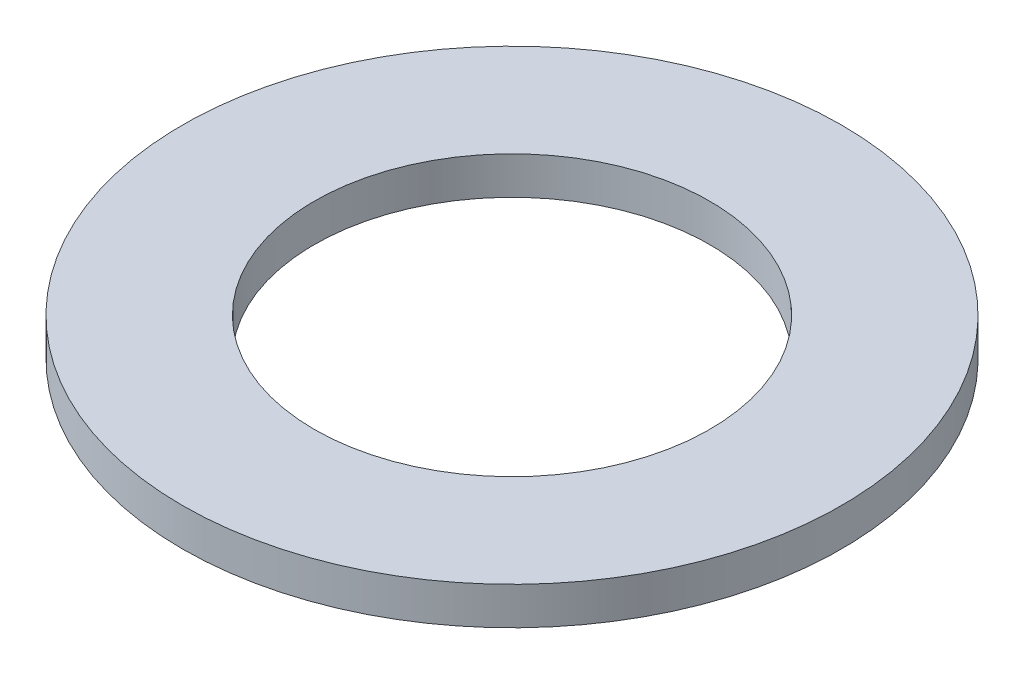
ISO-10303-21;
HEADER;
FILE_DESCRIPTION(('STEP AP214'),'2;1');
FILE_NAME('part.step','',(''),(''),'','','');
FILE_SCHEMA(('AUTOMOTIVE_DESIGN { 1 0 10303 214 1 1 1 1 }'));
ENDSEC;
DATA;
#1=APPLICATION_CONTEXT('core data for automotive mechanical design processes');
#2=APPLICATION_PROTOCOL_DEFINITION('international standard','automotive_design',2000,#1);
#3=PRODUCT_CONTEXT('',#1,'mechanical');
#4=PRODUCT('Part','Part','',(#3));
#5=PRODUCT_RELATED_PRODUCT_CATEGORY('part','',(#4));
#6=PRODUCT_DEFINITION_FORMATION('','',#4);
#7=PRODUCT_DEFINITION_CONTEXT('part definition',#1,'design');
#8=PRODUCT_DEFINITION('design','',#6,#7);
#9=PRODUCT_DEFINITION_SHAPE('','',#8);
#10=(LENGTH_UNIT() NAMED_UNIT(*) SI_UNIT(.MILLI.,.METRE.));
#11=(NAMED_UNIT(*) PLANE_ANGLE_UNIT() SI_UNIT($,.RADIAN.));
#12=(NAMED_UNIT(*) SI_UNIT($,.STERADIAN.) SOLID_ANGLE_UNIT());
#13=UNCERTAINTY_MEASURE_WITH_UNIT(LENGTH_MEASURE(1.E-05),#10,'distance_accuracy_value','');
#14=(GEOMETRIC_REPRESENTATION_CONTEXT(3) GLOBAL_UNCERTAINTY_ASSIGNED_CONTEXT((#13)) GLOBAL_UNIT_ASSIGNED_CONTEXT((#10,
#11,#12)) REPRESENTATION_CONTEXT('',''));
#15=CARTESIAN_POINT('',(0.,0.,0.));
#16=DIRECTION('',(0.,0.,1.));
#17=DIRECTION('',(1.,0.,0.));
#18=AXIS2_PLACEMENT_3D('',#15,#16,#17);
#19=CARTESIAN_POINT('',(0.,2.,0.));
#20=DIRECTION('',(0.,1.,0.));
#21=DIRECTION('',(0.,0.,1.));
#22=AXIS2_PLACEMENT_3D('',#19,#20,#21);
#23=PLANE('',#22);
#24=CARTESIAN_POINT('',(0.,2.,0.));
#25=DIRECTION('',(0.,1.,0.));
#26=DIRECTION('',(0.,0.,1.));
#27=AXIS2_PLACEMENT_3D('',#24,#25,#26);
#28=CIRCLE('',#27,17.5);
#29=CARTESIAN_POINT('',(0.,2.,17.5));
#30=VERTEX_POINT('',#29);
#31=EDGE_CURVE('E10',#30,#30,#28,.T.);
#32=ORIENTED_EDGE('',*,*,#31,.T.);
#33=EDGE_LOOP('',(#32));
#34=FACE_BOUND('',#33,.T.);
#35=CARTESIAN_POINT('',(0.,2.,0.));
#36=DIRECTION('',(0.,1.,0.));
#37=DIRECTION('',(0.,0.,1.));
#38=AXIS2_PLACEMENT_3D('',#35,#36,#37);
#39=CIRCLE('',#38,10.5);
#40=CARTESIAN_POINT('',(0.,2.,10.5));
#41=VERTEX_POINT('',#40);
#42=EDGE_CURVE('E43',#41,#41,#39,.T.);
#43=ORIENTED_EDGE('',*,*,#42,.F.);
#44=EDGE_LOOP('',(#43));
#45=FACE_BOUND('',#44,.T.);
#46=ADVANCED_FACE('F32',(#34,#45),#23,.T.);
#47=CARTESIAN_POINT('',(0.,0.,0.));
#48=DIRECTION('',(0.,1.,0.));
#49=DIRECTION('',(0.,0.,1.));
#50=AXIS2_PLACEMENT_3D('',#47,#48,#49);
#51=PLANE('',#50);
#52=CARTESIAN_POINT('',(0.,0.,0.));
#53=DIRECTION('',(0.,1.,0.));
#54=DIRECTION('',(0.,0.,1.));
#55=AXIS2_PLACEMENT_3D('',#52,#53,#54);
#56=CIRCLE('',#55,17.5);
#57=CARTESIAN_POINT('',(0.,0.,17.5));
#58=VERTEX_POINT('',#57);
#59=EDGE_CURVE('E36',#58,#58,#56,.T.);
#60=ORIENTED_EDGE('',*,*,#59,.F.);
#61=EDGE_LOOP('',(#60));
#62=FACE_BOUND('',#61,.T.);
#63=CARTESIAN_POINT('',(0.,0.,0.));
#64=DIRECTION('',(0.,1.,0.));
#65=DIRECTION('',(0.,0.,1.));
#66=AXIS2_PLACEMENT_3D('',#63,#64,#65);
#67=CIRCLE('',#66,10.5);
#68=CARTESIAN_POINT('',(0.,0.,10.5));
#69=VERTEX_POINT('',#68);
#70=EDGE_CURVE('E45',#69,#69,#67,.T.);
#71=ORIENTED_EDGE('',*,*,#70,.T.);
#72=EDGE_LOOP('',(#71));
#73=FACE_BOUND('',#72,.T.);
#74=ADVANCED_FACE('F55',(#62,#73),#51,.F.);
#75=CARTESIAN_POINT('',(0.,2.,0.));
#76=DIRECTION('',(0.,-1.,0.));
#77=DIRECTION('',(0.,0.,-1.));
#78=AXIS2_PLACEMENT_3D('',#75,#76,#77);
#79=CYLINDRICAL_SURFACE('',#78,17.5);
#80=ORIENTED_EDGE('',*,*,#31,.F.);
#81=EDGE_LOOP('',(#80));
#82=FACE_BOUND('',#81,.T.);
#83=ORIENTED_EDGE('',*,*,#59,.T.);
#84=EDGE_LOOP('',(#83));
#85=FACE_BOUND('',#84,.T.);
#86=ADVANCED_FACE('F34',(#82,#85),#79,.T.);
#87=CARTESIAN_POINT('',(0.,2.,0.));
#88=DIRECTION('',(0.,-1.,0.));
#89=DIRECTION('',(0.,0.,-1.));
#90=AXIS2_PLACEMENT_3D('',#87,#88,#89);
#91=CYLINDRICAL_SURFACE('',#90,10.5);
#92=ORIENTED_EDGE('',*,*,#42,.T.);
#93=EDGE_LOOP('',(#92));
#94=FACE_BOUND('',#93,.T.);
#95=ORIENTED_EDGE('',*,*,#70,.F.);
#96=EDGE_LOOP('',(#95));
#97=FACE_BOUND('',#96,.T.);
#98=ADVANCED_FACE('F51',(#94,#97),#91,.F.);
#99=CLOSED_SHELL('',(#46,#74,#86,#98));
#100=MANIFOLD_SOLID_BREP('B2',#99);
#101=ADVANCED_BREP_SHAPE_REPRESENTATION('',(#18,#100),#14);
#102=SHAPE_DEFINITION_REPRESENTATION(#9,#101);
ENDSEC;
END-ISO-10303-21;
